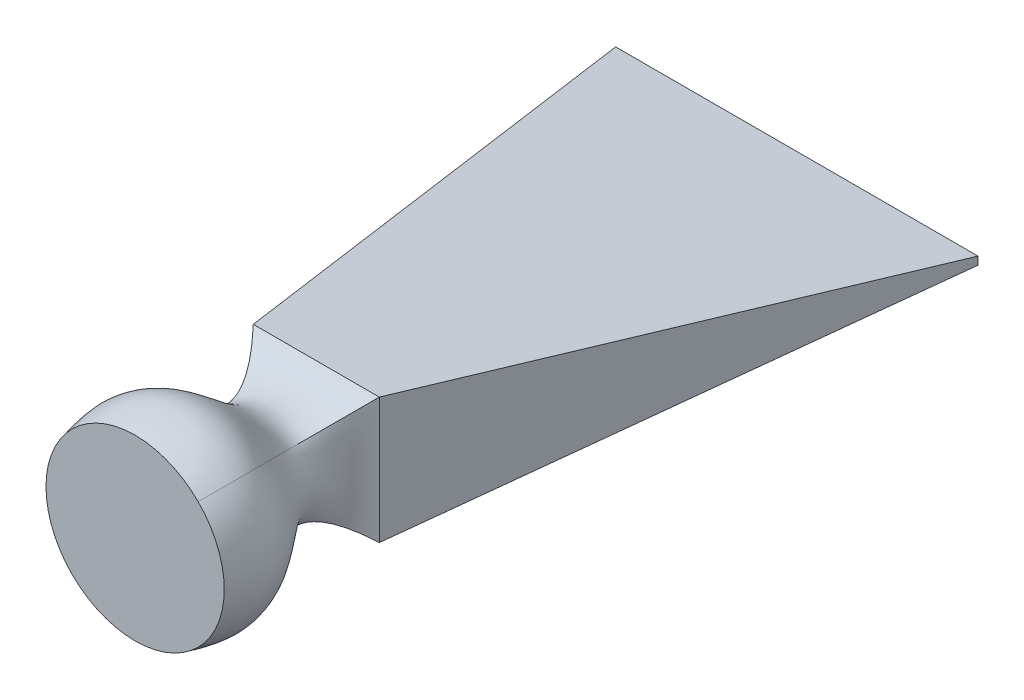
ISO-10303-21;
HEADER;
FILE_DESCRIPTION(('STEP AP214'),'2;1');
FILE_NAME('part.step','',(''),(''),'','','');
FILE_SCHEMA(('AUTOMOTIVE_DESIGN { 1 0 10303 214 1 1 1 1 }'));
ENDSEC;
DATA;
#1=APPLICATION_CONTEXT('core data for automotive mechanical design processes');
#2=APPLICATION_PROTOCOL_DEFINITION('international standard','automotive_design',2000,#1);
#3=PRODUCT_CONTEXT('',#1,'mechanical');
#4=PRODUCT('Part','Part','',(#3));
#5=PRODUCT_RELATED_PRODUCT_CATEGORY('part','',(#4));
#6=PRODUCT_DEFINITION_FORMATION('','',#4);
#7=PRODUCT_DEFINITION_CONTEXT('part definition',#1,'design');
#8=PRODUCT_DEFINITION('design','',#6,#7);
#9=PRODUCT_DEFINITION_SHAPE('','',#8);
#10=(LENGTH_UNIT() NAMED_UNIT(*) SI_UNIT(.MILLI.,.METRE.));
#11=(NAMED_UNIT(*) PLANE_ANGLE_UNIT() SI_UNIT($,.RADIAN.));
#12=(NAMED_UNIT(*) SI_UNIT($,.STERADIAN.) SOLID_ANGLE_UNIT());
#13=UNCERTAINTY_MEASURE_WITH_UNIT(LENGTH_MEASURE(1.E-05),#10,'distance_accuracy_value','');
#14=(GEOMETRIC_REPRESENTATION_CONTEXT(3) GLOBAL_UNCERTAINTY_ASSIGNED_CONTEXT((#13)) GLOBAL_UNIT_ASSIGNED_CONTEXT((#10,
#11,#12)) REPRESENTATION_CONTEXT('',''));
#15=CARTESIAN_POINT('',(0.,0.,0.));
#16=DIRECTION('',(0.,0.,1.));
#17=DIRECTION('',(1.,0.,0.));
#18=AXIS2_PLACEMENT_3D('',#15,#16,#17);
#19=CARTESIAN_POINT('',(0.,0.,69.));
#20=DIRECTION('',(0.,0.,1.));
#21=DIRECTION('',(1.,0.,0.));
#22=AXIS2_PLACEMENT_3D('',#19,#20,#21);
#23=PLANE('',#22);
#24=CARTESIAN_POINT('',(0.,0.,69.));
#25=DIRECTION('',(0.,0.,1.));
#26=DIRECTION('',(1.,0.,0.));
#27=AXIS2_PLACEMENT_3D('',#24,#25,#26);
#28=CIRCLE('',#27,33.9411254969543);
#29=CARTESIAN_POINT('',(24.,24.,69.));
#30=VERTEX_POINT('',#29);
#31=CARTESIAN_POINT('',(-24.,24.,69.));
#32=VERTEX_POINT('',#31);
#33=EDGE_CURVE('E12',#30,#32,#28,.T.);
#34=ORIENTED_EDGE('',*,*,#33,.T.);
#35=CARTESIAN_POINT('',(-24.,-24.,69.));
#36=VERTEX_POINT('',#35);
#37=EDGE_CURVE('E83',#32,#36,#28,.T.);
#38=ORIENTED_EDGE('',*,*,#37,.T.);
#39=CARTESIAN_POINT('',(24.,-24.,69.));
#40=VERTEX_POINT('',#39);
#41=EDGE_CURVE('E297',#36,#40,#28,.T.);
#42=ORIENTED_EDGE('',*,*,#41,.T.);
#43=EDGE_CURVE('E314',#40,#30,#28,.T.);
#44=ORIENTED_EDGE('',*,*,#43,.T.);
#45=EDGE_LOOP('',(#34,#38,#42,#44));
#46=FACE_BOUND('',#45,.T.);
#47=ADVANCED_FACE('F73',(#46),#23,.T.);
#48=CARTESIAN_POINT('',(-24.,24.,0.));
#49=CARTESIAN_POINT('',(-16.9566858950296,16.9566858950296,7.66666666666666));
#50=CARTESIAN_POINT('',(-7.89503734371141,7.8950373437114,24.3726743261737));
#51=CARTESIAN_POINT('',(-27.0998932157397,27.0998932157397,43.6489446315001));
#52=CARTESIAN_POINT('',(-25.5927897829124,25.5927897829124,60.6016908065351));
#53=CARTESIAN_POINT('',(-24.,24.,69.));
#54=CARTESIAN_POINT('',(-24.,8.,0.));
#55=CARTESIAN_POINT('',(-16.9566858950296,5.65222863167654,7.66666666666666));
#56=CARTESIAN_POINT('',(-16.8561027294646,4.494823042013,24.3726743261737));
#57=CARTESIAN_POINT('',(-41.3921089148202,12.0048701736808,43.6489446315001));
#58=CARTESIAN_POINT('',(-38.8387500210668,11.2849696894831,60.6016908065351));
#59=CARTESIAN_POINT('',(-37.2459602381544,10.7540397618456,69.));
#60=CARTESIAN_POINT('',(-24.,-8.,0.));
#61=CARTESIAN_POINT('',(-16.9566858950296,-5.65222863167653,7.66666666666666));
#62=CARTESIAN_POINT('',(-16.8561027294646,-4.494823042013,24.3726743261737));
#63=CARTESIAN_POINT('',(-41.3921089148202,-12.0048701736808,43.6489446315001));
#64=CARTESIAN_POINT('',(-38.8387500210668,-11.284969689483,60.6016908065351));
#65=CARTESIAN_POINT('',(-37.2459602381544,-10.7540397618456,69.));
#66=CARTESIAN_POINT('',(-24.,-24.,0.));
#67=CARTESIAN_POINT('',(-16.9566858950296,-16.9566858950296,7.66666666666666));
#68=CARTESIAN_POINT('',(-7.8950373437114,-7.8950373437114,24.3726743261737));
#69=CARTESIAN_POINT('',(-27.0998932157397,-27.0998932157397,43.6489446315001));
#70=CARTESIAN_POINT('',(-25.5927897829124,-25.5927897829124,60.6016908065351));
#71=CARTESIAN_POINT('',(-24.,-24.,69.));
#72=B_SPLINE_SURFACE_WITH_KNOTS('',3,3,((#48,#49,#50,#51,#52,#53),(#54,#55,#56,#57,#58,#59),
(#60,#61,#62,#63,#64,#65),(#66,#67,#68,#69,#70,#71)),.UNSPECIFIED.,.F.,.F.,.F.,(4,4),(4,1,1,4),
(0.,1.),(0.,0.335692317851831,0.697005695340703,1.),.UNSPECIFIED.);
#73=DIRECTION('',(0.,1.,0.));
#74=VECTOR('',#73,1.);
#75=CARTESIAN_POINT('',(-24.,24.,0.));
#76=LINE('',#75,#74);
#77=CARTESIAN_POINT('',(-24.,-24.,0.));
#78=VERTEX_POINT('',#77);
#79=CARTESIAN_POINT('',(-24.,24.,0.));
#80=VERTEX_POINT('',#79);
#81=EDGE_CURVE('E345',#78,#80,#76,.T.);
#82=CARTESIAN_POINT('',(-24.,-24.,0.));
#83=CARTESIAN_POINT('',(-16.9566858950296,-16.9566858950296,7.66666666666666));
#84=CARTESIAN_POINT('',(-7.8950373437114,-7.8950373437114,24.3726743261737));
#85=CARTESIAN_POINT('',(-27.0998932157397,-27.0998932157397,43.6489446315001));
#86=CARTESIAN_POINT('',(-25.5927897829124,-25.5927897829124,60.6016908065351));
#87=CARTESIAN_POINT('',(-24.,-24.,69.));
#88=B_SPLINE_CURVE_WITH_KNOTS('',3,(#82,#83,#84,#85,#86,#87),.UNSPECIFIED.,.F.,.F.,(4,1,1,4),
(0.,0.335692317851831,0.697005695340703,1.),.UNSPECIFIED.);
#89=EDGE_CURVE('E446',#78,#36,#88,.T.);
#90=CARTESIAN_POINT('',(-24.,24.,0.));
#91=CARTESIAN_POINT('',(-16.9566858950296,16.9566858950296,7.66666666666666));
#92=CARTESIAN_POINT('',(-7.89503734371141,7.8950373437114,24.3726743261737));
#93=CARTESIAN_POINT('',(-27.0998932157397,27.0998932157397,43.6489446315001));
#94=CARTESIAN_POINT('',(-25.5927897829124,25.5927897829124,60.6016908065351));
#95=CARTESIAN_POINT('',(-24.,24.,69.));
#96=B_SPLINE_CURVE_WITH_KNOTS('',3,(#90,#91,#92,#93,#94,#95),.UNSPECIFIED.,.F.,.F.,(4,1,1,4),
(0.,0.335692317851831,0.697005695340703,1.),.UNSPECIFIED.);
#97=EDGE_CURVE('E344',#32,#80,#96,.F.);
#98=ORIENTED_EDGE('',*,*,#81,.F.);
#99=ORIENTED_EDGE('',*,*,#89,.T.);
#100=ORIENTED_EDGE('',*,*,#37,.F.);
#101=ORIENTED_EDGE('',*,*,#97,.T.);
#102=EDGE_LOOP('',(#98,#99,#100,#101));
#103=FACE_BOUND('',#102,.T.);
#104=ADVANCED_FACE('F386',(#103),#72,.T.);
#105=CARTESIAN_POINT('',(-24.,-24.,0.));
#106=CARTESIAN_POINT('',(-16.9566858950296,-16.9566858950296,7.66666666666666));
#107=CARTESIAN_POINT('',(-7.89503734371141,-7.8950373437114,24.3726743261737));
#108=CARTESIAN_POINT('',(-27.0998932157397,-27.0998932157397,43.6489446315001));
#109=CARTESIAN_POINT('',(-25.5927897829124,-25.5927897829124,60.6016908065351));
#110=CARTESIAN_POINT('',(-24.,-24.,69.));
#111=CARTESIAN_POINT('',(-8.00000000000001,-24.,0.));
#112=CARTESIAN_POINT('',(-5.65222863167654,-16.9566858950296,7.66666666666667));
#113=CARTESIAN_POINT('',(-4.494823042013,-16.8561027294646,24.3726743261737));
#114=CARTESIAN_POINT('',(-12.0048701736808,-41.3921089148202,43.6489446315001));
#115=CARTESIAN_POINT('',(-11.2849696894831,-38.8387500210668,60.6016908065351));
#116=CARTESIAN_POINT('',(-10.7540397618456,-37.2459602381544,69.));
#117=CARTESIAN_POINT('',(7.99999999999999,-24.,0.));
#118=CARTESIAN_POINT('',(5.65222863167653,-16.9566858950296,7.66666666666667));
#119=CARTESIAN_POINT('',(4.494823042013,-16.8561027294646,24.3726743261737));
#120=CARTESIAN_POINT('',(12.0048701736808,-41.3921089148202,43.6489446315001));
#121=CARTESIAN_POINT('',(11.284969689483,-38.8387500210668,60.6016908065351));
#122=CARTESIAN_POINT('',(10.7540397618456,-37.2459602381544,69.));
#123=CARTESIAN_POINT('',(24.,-24.,0.));
#124=CARTESIAN_POINT('',(16.9566858950296,-16.9566858950296,7.66666666666667));
#125=CARTESIAN_POINT('',(7.8950373437114,-7.8950373437114,24.3726743261737));
#126=CARTESIAN_POINT('',(27.0998932157397,-27.0998932157397,43.6489446315001));
#127=CARTESIAN_POINT('',(25.5927897829124,-25.5927897829124,60.6016908065351));
#128=CARTESIAN_POINT('',(24.,-24.,69.));
#129=B_SPLINE_SURFACE_WITH_KNOTS('',3,3,((#105,#106,#107,#108,#109,#110),(#111,#112,#113,#114,
#115,#116),(#117,#118,#119,#120,#121,#122),(#123,#124,#125,#126,#127,#128)),.UNSPECIFIED.,.F.,
.F.,.F.,(4,4),(4,1,1,4),(0.,1.),(0.,0.335692317851831,0.697005695340703,1.),.UNSPECIFIED.);
#130=DIRECTION('',(-1.,0.,0.));
#131=VECTOR('',#130,1.);
#132=CARTESIAN_POINT('',(-24.,-24.,0.));
#133=LINE('',#132,#131);
#134=CARTESIAN_POINT('',(24.,-24.,0.));
#135=VERTEX_POINT('',#134);
#136=EDGE_CURVE('E163',#135,#78,#133,.T.);
#137=CARTESIAN_POINT('',(24.,-24.,0.));
#138=CARTESIAN_POINT('',(16.9566858950296,-16.9566858950296,7.66666666666667));
#139=CARTESIAN_POINT('',(7.8950373437114,-7.8950373437114,24.3726743261737));
#140=CARTESIAN_POINT('',(27.0998932157397,-27.0998932157397,43.6489446315001));
#141=CARTESIAN_POINT('',(25.5927897829124,-25.5927897829124,60.6016908065351));
#142=CARTESIAN_POINT('',(24.,-24.,69.));
#143=B_SPLINE_CURVE_WITH_KNOTS('',3,(#137,#138,#139,#140,#141,#142),.UNSPECIFIED.,.F.,.F.,(4,1,
1,4),(0.,0.335692317851831,0.697005695340703,1.),.UNSPECIFIED.);
#144=EDGE_CURVE('E441',#135,#40,#143,.T.);
#145=ORIENTED_EDGE('',*,*,#136,.F.);
#146=ORIENTED_EDGE('',*,*,#144,.T.);
#147=ORIENTED_EDGE('',*,*,#41,.F.);
#148=ORIENTED_EDGE('',*,*,#89,.F.);
#149=EDGE_LOOP('',(#145,#146,#147,#148));
#150=FACE_BOUND('',#149,.T.);
#151=ADVANCED_FACE('F268',(#150),#129,.T.);
#152=CARTESIAN_POINT('',(24.,24.,0.));
#153=CARTESIAN_POINT('',(16.9566858950296,16.9566858950296,7.66666666666666));
#154=CARTESIAN_POINT('',(7.89503734371139,7.89503734371141,24.3726743261737));
#155=CARTESIAN_POINT('',(27.0998932157397,27.0998932157397,43.6489446315001));
#156=CARTESIAN_POINT('',(25.5927897829124,25.5927897829124,60.6016908065351));
#157=CARTESIAN_POINT('',(24.,24.,69.));
#158=CARTESIAN_POINT('',(7.99999999999999,24.,0.));
#159=CARTESIAN_POINT('',(5.65222863167653,16.9566858950296,7.66666666666666));
#160=CARTESIAN_POINT('',(4.49482304201299,16.8561027294646,24.3726743261737));
#161=CARTESIAN_POINT('',(12.0048701736808,41.3921089148202,43.6489446315001));
#162=CARTESIAN_POINT('',(11.2849696894831,38.8387500210668,60.6016908065351));
#163=CARTESIAN_POINT('',(10.7540397618456,37.2459602381544,69.));
#164=CARTESIAN_POINT('',(-8.00000000000001,24.,0.));
#165=CARTESIAN_POINT('',(-5.65222863167654,16.9566858950296,7.66666666666666));
#166=CARTESIAN_POINT('',(-4.494823042013,16.8561027294646,24.3726743261737));
#167=CARTESIAN_POINT('',(-12.0048701736808,41.3921089148202,43.6489446315001));
#168=CARTESIAN_POINT('',(-11.284969689483,38.8387500210668,60.6016908065351));
#169=CARTESIAN_POINT('',(-10.7540397618456,37.2459602381544,69.));
#170=CARTESIAN_POINT('',(-24.,24.,0.));
#171=CARTESIAN_POINT('',(-16.9566858950296,16.9566858950296,7.66666666666666));
#172=CARTESIAN_POINT('',(-7.89503734371141,7.8950373437114,24.3726743261737));
#173=CARTESIAN_POINT('',(-27.0998932157397,27.0998932157397,43.6489446315001));
#174=CARTESIAN_POINT('',(-25.5927897829124,25.5927897829124,60.6016908065351));
#175=CARTESIAN_POINT('',(-24.,24.,69.));
#176=B_SPLINE_SURFACE_WITH_KNOTS('',3,3,((#152,#153,#154,#155,#156,#157),(#158,#159,#160,#161,
#162,#163),(#164,#165,#166,#167,#168,#169),(#170,#171,#172,#173,#174,#175)),.UNSPECIFIED.,.F.,
.F.,.F.,(4,4),(4,1,1,4),(0.,1.),(0.,0.335692317851831,0.697005695340703,1.),.UNSPECIFIED.);
#177=DIRECTION('',(1.,0.,0.));
#178=VECTOR('',#177,1.);
#179=CARTESIAN_POINT('',(-24.,24.,0.));
#180=LINE('',#179,#178);
#181=CARTESIAN_POINT('',(24.,24.,0.));
#182=VERTEX_POINT('',#181);
#183=EDGE_CURVE('E249',#80,#182,#180,.T.);
#184=CARTESIAN_POINT('',(24.,24.,0.));
#185=CARTESIAN_POINT('',(16.9566858950296,16.9566858950296,7.66666666666666));
#186=CARTESIAN_POINT('',(7.89503734371139,7.89503734371139,24.3726743261737));
#187=CARTESIAN_POINT('',(27.0998932157397,27.0998932157397,43.6489446315001));
#188=CARTESIAN_POINT('',(25.5927897829124,25.5927897829124,60.6016908065351));
#189=CARTESIAN_POINT('',(24.,24.,69.));
#190=B_SPLINE_CURVE_WITH_KNOTS('',3,(#184,#185,#186,#187,#188,#189),.UNSPECIFIED.,.F.,.F.,(4,1,
1,4),(0.,0.335692317851831,0.697005695340703,1.),.UNSPECIFIED.);
#191=EDGE_CURVE('E255',#182,#30,#190,.T.);
#192=ORIENTED_EDGE('',*,*,#183,.F.);
#193=ORIENTED_EDGE('',*,*,#97,.F.);
#194=ORIENTED_EDGE('',*,*,#33,.F.);
#195=ORIENTED_EDGE('',*,*,#191,.F.);
#196=EDGE_LOOP('',(#192,#193,#194,#195));
#197=FACE_BOUND('',#196,.T.);
#198=ADVANCED_FACE('F257',(#197),#176,.T.);
#199=CARTESIAN_POINT('',(24.,-24.,0.));
#200=CARTESIAN_POINT('',(16.9566858950296,-16.9566858950296,7.66666666666667));
#201=CARTESIAN_POINT('',(7.89503734371139,-7.8950373437114,24.3726743261737));
#202=CARTESIAN_POINT('',(27.0998932157397,-27.0998932157397,43.6489446315001));
#203=CARTESIAN_POINT('',(25.5927897829124,-25.5927897829124,60.6016908065351));
#204=CARTESIAN_POINT('',(24.,-24.,69.));
#205=CARTESIAN_POINT('',(24.,-8.,0.));
#206=CARTESIAN_POINT('',(16.9566858950296,-5.65222863167653,7.66666666666667));
#207=CARTESIAN_POINT('',(16.8561027294646,-4.494823042013,24.3726743261737));
#208=CARTESIAN_POINT('',(41.3921089148202,-12.0048701736808,43.6489446315001));
#209=CARTESIAN_POINT('',(38.8387500210668,-11.2849696894831,60.6016908065351));
#210=CARTESIAN_POINT('',(37.2459602381544,-10.7540397618456,69.));
#211=CARTESIAN_POINT('',(24.,8.,0.));
#212=CARTESIAN_POINT('',(16.9566858950296,5.65222863167654,7.66666666666666));
#213=CARTESIAN_POINT('',(16.8561027294646,4.49482304201299,24.3726743261737));
#214=CARTESIAN_POINT('',(41.3921089148202,12.0048701736808,43.6489446315001));
#215=CARTESIAN_POINT('',(38.8387500210668,11.284969689483,60.6016908065351));
#216=CARTESIAN_POINT('',(37.2459602381544,10.7540397618456,69.));
#217=CARTESIAN_POINT('',(24.,24.,0.));
#218=CARTESIAN_POINT('',(16.9566858950296,16.9566858950296,7.66666666666666));
#219=CARTESIAN_POINT('',(7.89503734371139,7.89503734371139,24.3726743261737));
#220=CARTESIAN_POINT('',(27.0998932157397,27.0998932157397,43.6489446315001));
#221=CARTESIAN_POINT('',(25.5927897829124,25.5927897829124,60.6016908065351));
#222=CARTESIAN_POINT('',(24.,24.,69.));
#223=B_SPLINE_SURFACE_WITH_KNOTS('',3,3,((#199,#200,#201,#202,#203,#204),(#205,#206,#207,#208,
#209,#210),(#211,#212,#213,#214,#215,#216),(#217,#218,#219,#220,#221,#222)),.UNSPECIFIED.,.F.,
.F.,.F.,(4,4),(4,1,1,4),(0.,1.),(0.,0.335692317851831,0.697005695340703,1.),.UNSPECIFIED.);
#224=DIRECTION('',(0.,-1.,0.));
#225=VECTOR('',#224,1.);
#226=CARTESIAN_POINT('',(24.,24.,0.));
#227=LINE('',#226,#225);
#228=EDGE_CURVE('E77',#182,#135,#227,.T.);
#229=ORIENTED_EDGE('',*,*,#228,.F.);
#230=ORIENTED_EDGE('',*,*,#191,.T.);
#231=ORIENTED_EDGE('',*,*,#43,.F.);
#232=ORIENTED_EDGE('',*,*,#144,.F.);
#233=EDGE_LOOP('',(#229,#230,#231,#232));
#234=FACE_BOUND('',#233,.T.);
#235=ADVANCED_FACE('F225',(#234),#223,.T.);
#236=CARTESIAN_POINT('',(0.,0.,-183.));
#237=DIRECTION('',(0.,0.,-1.));
#238=DIRECTION('',(-1.,0.,0.));
#239=AXIS2_PLACEMENT_3D('',#236,#237,#238);
#240=PLANE('',#239);
#241=DIRECTION('',(0.,-1.,0.));
#242=VECTOR('',#241,1.);
#243=CARTESIAN_POINT('',(-69.,1.49999999999999,-183.));
#244=LINE('',#243,#242);
#245=CARTESIAN_POINT('',(-69.,1.49999999999999,-183.));
#246=VERTEX_POINT('',#245);
#247=CARTESIAN_POINT('',(-69.,-1.50000000000001,-183.));
#248=VERTEX_POINT('',#247);
#249=EDGE_CURVE('E154',#246,#248,#244,.T.);
#250=ORIENTED_EDGE('',*,*,#249,.F.);
#251=DIRECTION('',(-1.,0.,0.));
#252=VECTOR('',#251,1.);
#253=CARTESIAN_POINT('',(69.,1.50000000000001,-183.));
#254=LINE('',#253,#252);
#255=CARTESIAN_POINT('',(69.,1.50000000000001,-183.));
#256=VERTEX_POINT('',#255);
#257=EDGE_CURVE('E135',#256,#246,#254,.T.);
#258=ORIENTED_EDGE('',*,*,#257,.F.);
#259=DIRECTION('',(0.,1.,0.));
#260=VECTOR('',#259,1.);
#261=CARTESIAN_POINT('',(69.,1.50000000000001,-183.));
#262=LINE('',#261,#260);
#263=CARTESIAN_POINT('',(69.,-1.49999999999999,-183.));
#264=VERTEX_POINT('',#263);
#265=EDGE_CURVE('E126',#264,#256,#262,.T.);
#266=ORIENTED_EDGE('',*,*,#265,.F.);
#267=DIRECTION('',(1.,0.,0.));
#268=VECTOR('',#267,1.);
#269=CARTESIAN_POINT('',(69.,-1.49999999999999,-183.));
#270=LINE('',#269,#268);
#271=EDGE_CURVE('E131',#248,#264,#270,.T.);
#272=ORIENTED_EDGE('',*,*,#271,.F.);
#273=EDGE_LOOP('',(#250,#258,#266,#272));
#274=FACE_BOUND('',#273,.T.);
#275=ADVANCED_FACE('F130',(#274),#240,.T.);
#276=CARTESIAN_POINT('',(0.,23.6425971275399,-2.906876696009));
#277=DIRECTION('',(0.,0.992526177814719,-0.122031907108367));
#278=DIRECTION('',(0.,0.122031907108367,0.992526177814719));
#279=AXIS2_PLACEMENT_3D('',#276,#277,#278);
#280=PLANE('',#279);
#281=DIRECTION('',(0.237104148345924,0.118552074172962,0.964223536606757));
#282=VECTOR('',#281,1.);
#283=CARTESIAN_POINT('',(-69.,1.49999999999999,-183.));
#284=LINE('',#283,#282);
#285=EDGE_CURVE('E207',#246,#80,#284,.T.);
#286=ORIENTED_EDGE('',*,*,#285,.T.);
#287=ORIENTED_EDGE('',*,*,#183,.T.);
#288=DIRECTION('',(-0.237104148345924,0.118552074172962,0.964223536606757));
#289=VECTOR('',#288,1.);
#290=CARTESIAN_POINT('',(69.,1.50000000000001,-183.));
#291=LINE('',#290,#289);
#292=EDGE_CURVE('E164',#256,#182,#291,.T.);
#293=ORIENTED_EDGE('',*,*,#292,.F.);
#294=ORIENTED_EDGE('',*,*,#257,.T.);
#295=EDGE_LOOP('',(#286,#287,#293,#294));
#296=FACE_BOUND('',#295,.T.);
#297=ADVANCED_FACE('F188',(#296),#280,.T.);
#298=CARTESIAN_POINT('',(22.6315255955398,0.,5.56512924480486));
#299=DIRECTION('',(0.971071693103805,0.,0.238788121255034));
#300=DIRECTION('',(0.238788121255034,0.,-0.971071693103805));
#301=AXIS2_PLACEMENT_3D('',#298,#299,#300);
#302=PLANE('',#301);
#303=ORIENTED_EDGE('',*,*,#292,.T.);
#304=ORIENTED_EDGE('',*,*,#228,.T.);
#305=DIRECTION('',(-0.237104148345924,-0.118552074172962,0.964223536606757));
#306=VECTOR('',#305,1.);
#307=CARTESIAN_POINT('',(69.,-1.49999999999999,-183.));
#308=LINE('',#307,#306);
#309=EDGE_CURVE('E151',#264,#135,#308,.T.);
#310=ORIENTED_EDGE('',*,*,#309,.F.);
#311=ORIENTED_EDGE('',*,*,#265,.T.);
#312=EDGE_LOOP('',(#303,#304,#310,#311));
#313=FACE_BOUND('',#312,.T.);
#314=ADVANCED_FACE('F159',(#313),#302,.T.);
#315=CARTESIAN_POINT('',(-22.6315255955398,0.,5.56512924480487));
#316=DIRECTION('',(-0.971071693103805,0.,0.238788121255034));
#317=DIRECTION('',(0.238788121255034,0.,0.971071693103805));
#318=AXIS2_PLACEMENT_3D('',#315,#316,#317);
#319=PLANE('',#318);
#320=DIRECTION('',(0.237104148345924,-0.118552074172962,0.964223536606757));
#321=VECTOR('',#320,1.);
#322=CARTESIAN_POINT('',(-69.,-1.50000000000001,-183.));
#323=LINE('',#322,#321);
#324=EDGE_CURVE('E153',#248,#78,#323,.T.);
#325=ORIENTED_EDGE('',*,*,#324,.T.);
#326=ORIENTED_EDGE('',*,*,#81,.T.);
#327=ORIENTED_EDGE('',*,*,#285,.F.);
#328=ORIENTED_EDGE('',*,*,#249,.T.);
#329=EDGE_LOOP('',(#325,#326,#327,#328));
#330=FACE_BOUND('',#329,.T.);
#331=ADVANCED_FACE('F187',(#330),#319,.T.);
#332=CARTESIAN_POINT('',(0.,-23.6425971275399,-2.906876696009));
#333=DIRECTION('',(0.,-0.992526177814719,-0.122031907108367));
#334=DIRECTION('',(0.,0.122031907108367,-0.992526177814719));
#335=AXIS2_PLACEMENT_3D('',#332,#333,#334);
#336=PLANE('',#335);
#337=ORIENTED_EDGE('',*,*,#309,.T.);
#338=ORIENTED_EDGE('',*,*,#136,.T.);
#339=ORIENTED_EDGE('',*,*,#324,.F.);
#340=ORIENTED_EDGE('',*,*,#271,.T.);
#341=EDGE_LOOP('',(#337,#338,#339,#340));
#342=FACE_BOUND('',#341,.T.);
#343=ADVANCED_FACE('F149',(#342),#336,.T.);
#344=CLOSED_SHELL('',(#47,#104,#151,#198,#235,#275,#297,#314,#331,#343));
#345=MANIFOLD_SOLID_BREP('B2',#344);
#346=ADVANCED_BREP_SHAPE_REPRESENTATION('',(#18,#345),#14);
#347=SHAPE_DEFINITION_REPRESENTATION(#9,#346);
ENDSEC;
END-ISO-10303-21;
